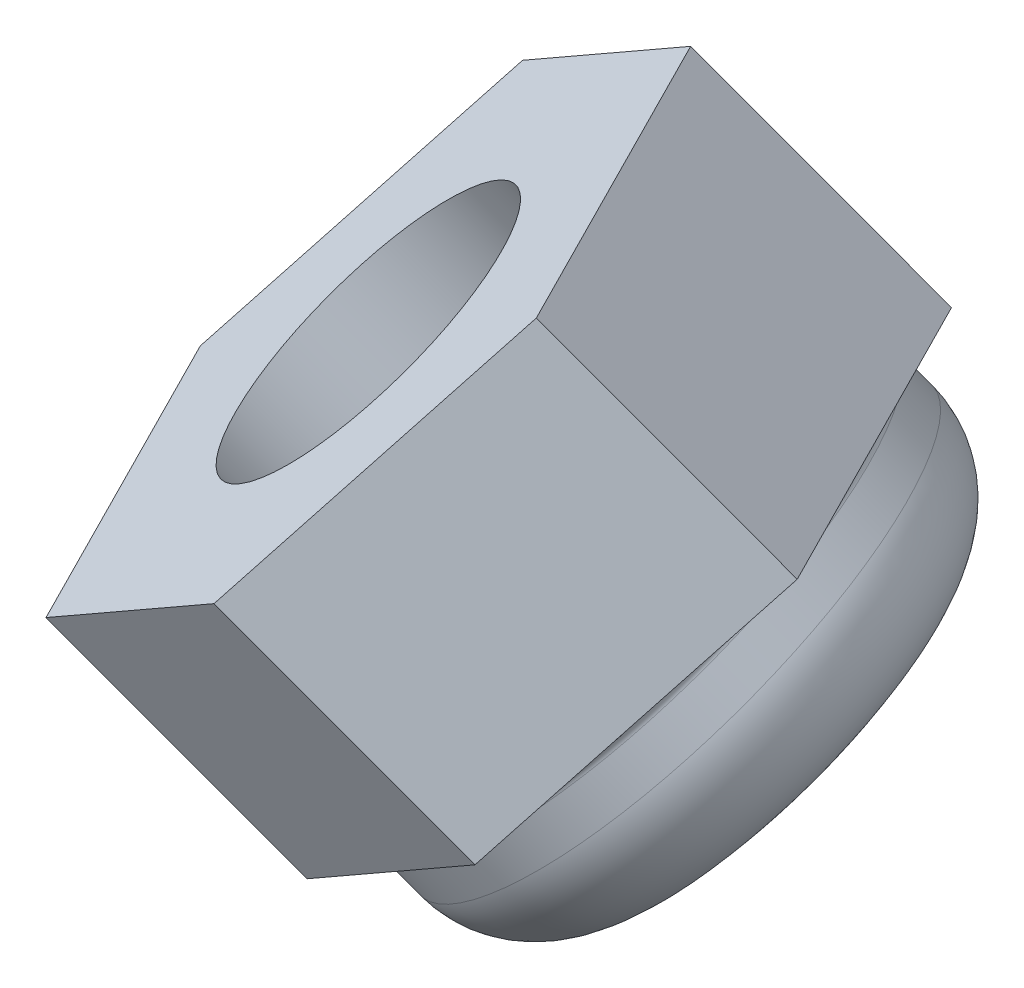
ISO-10303-21;
HEADER;
FILE_DESCRIPTION(('STEP AP214'),'2;1');
FILE_NAME('part.step','',(''),(''),'','','');
FILE_SCHEMA(('AUTOMOTIVE_DESIGN { 1 0 10303 214 1 1 1 1 }'));
ENDSEC;
DATA;
#1=APPLICATION_CONTEXT('core data for automotive mechanical design processes');
#2=APPLICATION_PROTOCOL_DEFINITION('international standard','automotive_design',2000,#1);
#3=PRODUCT_CONTEXT('',#1,'mechanical');
#4=PRODUCT('Part','Part','',(#3));
#5=PRODUCT_RELATED_PRODUCT_CATEGORY('part','',(#4));
#6=PRODUCT_DEFINITION_FORMATION('','',#4);
#7=PRODUCT_DEFINITION_CONTEXT('part definition',#1,'design');
#8=PRODUCT_DEFINITION('design','',#6,#7);
#9=PRODUCT_DEFINITION_SHAPE('','',#8);
#10=(LENGTH_UNIT() NAMED_UNIT(*) SI_UNIT(.MILLI.,.METRE.));
#11=(NAMED_UNIT(*) PLANE_ANGLE_UNIT() SI_UNIT($,.RADIAN.));
#12=(NAMED_UNIT(*) SI_UNIT($,.STERADIAN.) SOLID_ANGLE_UNIT());
#13=UNCERTAINTY_MEASURE_WITH_UNIT(LENGTH_MEASURE(1.E-05),#10,'distance_accuracy_value','');
#14=(GEOMETRIC_REPRESENTATION_CONTEXT(3) GLOBAL_UNCERTAINTY_ASSIGNED_CONTEXT((#13)) GLOBAL_UNIT_ASSIGNED_CONTEXT((#10,
#11,#12)) REPRESENTATION_CONTEXT('',''));
#15=CARTESIAN_POINT('',(0.,0.,0.));
#16=DIRECTION('',(0.,0.,1.));
#17=DIRECTION('',(1.,0.,0.));
#18=AXIS2_PLACEMENT_3D('',#15,#16,#17);
#19=CARTESIAN_POINT('',(-7.81654763488652,-44.7743989689793,-57.2258527698471));
#20=DIRECTION('',(-0.61290058053373,0.707106781184313,0.352637034902145));
#21=DIRECTION('',(-0.755649570705954,-0.654976126505315,0.));
#22=AXIS2_PLACEMENT_3D('',#19,#20,#21);
#23=CYLINDRICAL_SURFACE('',#22,1.49999999999652);
#24=CARTESIAN_POINT('',(-10.4213751021575,-41.7691951489429,-55.7271453715115));
#25=DIRECTION('',(-0.61290058053373,0.707106781184313,0.352637034902145));
#26=DIRECTION('',(-0.755649570705954,-0.654976126505315,0.));
#27=AXIS2_PLACEMENT_3D('',#24,#25,#26);
#28=CIRCLE('',#27,1.49999999999652);
#29=CARTESIAN_POINT('',(-11.5548494582138,-42.7516593386986,-55.7271453715115));
#30=VERTEX_POINT('',#29);
#31=EDGE_CURVE('E105',#30,#30,#28,.T.);
#32=ORIENTED_EDGE('',*,*,#31,.T.);
#33=EDGE_LOOP('',(#32));
#34=FACE_BOUND('',#33,.T.);
#35=CARTESIAN_POINT('',(-7.81654763488652,-44.7743989689793,-57.2258527698471));
#36=DIRECTION('',(-0.61290058053373,0.707106781184313,0.352637034902145));
#37=DIRECTION('',(-0.755649570705954,-0.654976126505315,0.));
#38=AXIS2_PLACEMENT_3D('',#35,#36,#37);
#39=CIRCLE('',#38,1.49999999999652);
#40=CARTESIAN_POINT('',(-8.95002199094282,-45.756863158735,-57.2258527698471));
#41=VERTEX_POINT('',#40);
#42=EDGE_CURVE('E109',#41,#41,#39,.T.);
#43=ORIENTED_EDGE('',*,*,#42,.F.);
#44=EDGE_LOOP('',(#43));
#45=FACE_BOUND('',#44,.T.);
#46=ADVANCED_FACE('F17',(#34,#45),#23,.F.);
#47=CARTESIAN_POINT('',(-6.011456576919,-43.22113606169,-57.20311374404));
#48=DIRECTION('',(0.612900580532539,-0.707106781186679,-0.352637034899471));
#49=DIRECTION('',(-0.378104557586791,-0.654330019279194,0.654896304312512));
#50=AXIS2_PLACEMENT_3D('',#47,#48,#49);
#51=PLANE('',#50);
#52=ORIENTED_EDGE('',*,*,#42,.T.);
#53=EDGE_LOOP('',(#52));
#54=FACE_BOUND('',#53,.T.);
#55=CARTESIAN_POINT('',(-7.81654763488971,-44.7743989689915,-57.2258527698307));
#56=DIRECTION('',(-0.612900580531282,0.70710678118801,0.352637034898986));
#57=DIRECTION('',(0.3781045575874,0.65433001927786,-0.654896304313494));
#58=AXIS2_PLACEMENT_3D('',#55,#56,#57);
#59=CIRCLE('',#58,1.60000000000153);
#60=CARTESIAN_POINT('',(-8.42151492702986,-45.8213269998347,-56.178018682929));
#61=VERTEX_POINT('',#60);
#62=CARTESIAN_POINT('',(-7.21158034275055,-43.7274709381431,-58.2736868567318));
#63=VERTEX_POINT('',#62);
#64=EDGE_CURVE('E112',#61,#63,#59,.F.);
#65=ORIENTED_EDGE('',*,*,#64,.T.);
#66=CARTESIAN_POINT('',(-7.81654763488971,-44.7743989689915,-57.2258527698307));
#67=DIRECTION('',(-0.612900580531282,0.70710678118801,0.352637034898986));
#68=DIRECTION('',(-0.378104557587544,-0.654330019277914,0.654896304313357));
#69=AXIS2_PLACEMENT_3D('',#66,#67,#68);
#70=CIRCLE('',#69,1.60000000000153);
#71=EDGE_CURVE('E108',#63,#61,#70,.F.);
#72=ORIENTED_EDGE('',*,*,#71,.T.);
#73=EDGE_LOOP('',(#65,#72));
#74=FACE_BOUND('',#73,.T.);
#75=ADVANCED_FACE('F189',(#54,#74),#51,.T.);
#76=CARTESIAN_POINT('',(-7.173389440549,-38.81574595516,-56.00423383806));
#77=DIRECTION('',(0.61290058053355,-0.707106781186272,-0.35263703489853));
#78=DIRECTION('',(-0.378104557586111,-0.654330019278962,0.654896304313137));
#79=AXIS2_PLACEMENT_3D('',#76,#77,#78);
#80=PLANE('',#79);
#81=ORIENTED_EDGE('',*,*,#31,.F.);
#82=EDGE_LOOP('',(#81));
#83=FACE_BOUND('',#82,.T.);
#84=DIRECTION('',(0.78992028962174,0.559305418448253,0.251402833990253));
#85=VECTOR('',#84,1.);
#86=CARTESIAN_POINT('',(-10.4748987801751,-40.5794348969403,-58.2058760464043));
#87=LINE('',#86,#85);
#88=CARTESIAN_POINT('',(-11.7290656827647,-41.4674515151694,-58.6050316545677));
#89=VERTEX_POINT('',#88);
#90=CARTESIAN_POINT('',(-9.22073187769769,-39.691418278793,-57.8067204382735));
#91=VERTEX_POINT('',#90);
#92=EDGE_CURVE('E147',#89,#91,#87,.T.);
#93=ORIENTED_EDGE('',*,*,#92,.F.);
#94=DIRECTION('',(0.378104557587663,0.654330019278937,-0.654896304312266));
#95=VECTOR('',#94,1.);
#96=CARTESIAN_POINT('',(-12.3293872950506,-42.5063399502852,-57.5652441212044));
#97=LINE('',#96,#95);
#98=CARTESIAN_POINT('',(-12.9297089073393,-43.5452283854007,-56.5254565878416));
#99=VERTEX_POINT('',#98);
#100=EDGE_CURVE('E151',#99,#89,#97,.T.);
#101=ORIENTED_EDGE('',*,*,#100,.F.);
#102=DIRECTION('',(-0.411815732035274,0.0950246008273509,-0.906299138301397));
#103=VECTOR('',#102,1.);
#104=CARTESIAN_POINT('',(-12.2758636170356,-43.6961002022853,-55.0865134463143));
#105=LINE('',#104,#103);
#106=CARTESIAN_POINT('',(-11.6220183266162,-43.8469720190935,-53.6475703047494));
#107=VERTEX_POINT('',#106);
#108=EDGE_CURVE('E85',#107,#99,#105,.T.);
#109=ORIENTED_EDGE('',*,*,#108,.F.);
#110=DIRECTION('',(-0.789920289620018,-0.55930541845189,-0.251402833987573));
#111=VECTOR('',#110,1.);
#112=CARTESIAN_POINT('',(-10.3678514241397,-42.9589554009452,-53.2484146966194));
#113=LINE('',#112,#111);
#114=CARTESIAN_POINT('',(-9.11368452155204,-42.0709387827129,-52.8492590884546));
#115=VERTEX_POINT('',#114);
#116=EDGE_CURVE('E81',#115,#107,#113,.T.);
#117=ORIENTED_EDGE('',*,*,#116,.F.);
#118=DIRECTION('',(-0.378104557586419,-0.654330019277777,0.654896304314142));
#119=VECTOR('',#118,1.);
#120=CARTESIAN_POINT('',(-8.51336290926467,-41.0320503475954,-53.8890466218194));
#121=LINE('',#120,#119);
#122=CARTESIAN_POINT('',(-7.91304129697766,-39.9931619124808,-54.9288341551821));
#123=VERTEX_POINT('',#122);
#124=EDGE_CURVE('E156',#123,#115,#121,.T.);
#125=ORIENTED_EDGE('',*,*,#124,.F.);
#126=DIRECTION('',(0.411815732033934,-0.0950246008270996,0.906299138302032));
#127=VECTOR('',#126,1.);
#128=CARTESIAN_POINT('',(-8.56688658728017,-39.8422900955953,-56.3677772967094));
#129=LINE('',#128,#127);
#130=EDGE_CURVE('E137',#91,#123,#129,.T.);
#131=ORIENTED_EDGE('',*,*,#130,.F.);
#132=EDGE_LOOP('',(#93,#101,#109,#117,#125,#131));
#133=FACE_BOUND('',#132,.T.);
#134=ADVANCED_FACE('F166',(#83,#133),#80,.F.);
#135=CARTESIAN_POINT('',(-8.42944821542099,-44.0672921878035,-56.8732157349317));
#136=DIRECTION('',(0.612900580531282,-0.70710678118801,-0.352637034898986));
#137=DIRECTION('',(-0.378104557588239,-0.654330019278183,0.654896304312686));
#138=AXIS2_PLACEMENT_3D('',#135,#136,#137);
#139=TOROIDAL_SURFACE('',#138,1.60000000000219,1.);
#140=ORIENTED_EDGE('',*,*,#64,.F.);
#141=ORIENTED_EDGE('',*,*,#71,.F.);
#142=EDGE_LOOP('',(#140,#141));
#143=FACE_BOUND('',#142,.T.);
#144=CARTESIAN_POINT('',(-8.42944821543103,-44.0672921877919,-56.873215734926));
#145=DIRECTION('',(0.612900580536237,-0.70710678118257,-0.352637034901283));
#146=DIRECTION('',(-0.378104557584169,-0.654330019283159,0.654896304310064));
#147=AXIS2_PLACEMENT_3D('',#144,#145,#146);
#148=CIRCLE('',#147,2.59999999999843);
#149=CARTESIAN_POINT('',(-9.41252006514927,-45.7685502379271,-55.1704853437208));
#150=VERTEX_POINT('',#149);
#151=EDGE_CURVE('E101',#150,#150,#148,.T.);
#152=ORIENTED_EDGE('',*,*,#151,.T.);
#153=EDGE_LOOP('',(#152));
#154=FACE_BOUND('',#153,.T.);
#155=ADVANCED_FACE('F161',(#143,#154),#139,.T.);
#156=CARTESIAN_POINT('',(-7.922737964415,-39.91271550211,-54.9510306196));
#157=DIRECTION('',(0.693822615598157,0.268052655033845,0.668399545342334));
#158=DIRECTION('',(-0.378104557586418,-0.654330019277778,0.654896304314143));
#159=AXIS2_PLACEMENT_3D('',#156,#157,#158);
#160=PLANE('',#159);
#161=ORIENTED_EDGE('',*,*,#124,.T.);
#162=DIRECTION('',(-0.612900580533941,0.707106781185783,0.352637034898832));
#163=VECTOR('',#162,1.);
#164=CARTESIAN_POINT('',(-8.27094622331854,-43.0432106068442,-53.3341350114415));
#165=LINE('',#164,#163);
#166=CARTESIAN_POINT('',(-7.42820792508417,-44.0154824309769,-53.8190109344259));
#167=VERTEX_POINT('',#166);
#168=EDGE_CURVE('E67',#167,#115,#165,.T.);
#169=ORIENTED_EDGE('',*,*,#168,.F.);
#170=DIRECTION('',(-0.378104557586366,-0.654330019278157,0.654896304313794));
#171=VECTOR('',#170,1.);
#172=CARTESIAN_POINT('',(-6.82788631279821,-42.9765939958637,-54.8587984677878));
#173=LINE('',#172,#171);
#174=CARTESIAN_POINT('',(-6.22756470051156,-41.9377055607489,-55.8985860011516));
#175=VERTEX_POINT('',#174);
#176=EDGE_CURVE('E99',#175,#167,#173,.T.);
#177=ORIENTED_EDGE('',*,*,#176,.F.);
#178=DIRECTION('',(0.612900580532254,-0.707106781187635,-0.35263703489805));
#179=VECTOR('',#178,1.);
#180=CARTESIAN_POINT('',(-7.07030299874465,-40.9654337366145,-55.4137100781663));
#181=LINE('',#180,#179);
#182=EDGE_CURVE('E145',#123,#175,#181,.T.);
#183=ORIENTED_EDGE('',*,*,#182,.F.);
#184=EDGE_LOOP('',(#161,#169,#177,#183));
#185=FACE_BOUND('',#184,.T.);
#186=ADVANCED_FACE('F165',(#185),#160,.T.);
#187=CARTESIAN_POINT('',(-9.097227377378,-41.99652724502,-52.81389782721));
#188=DIRECTION('',(0.0194631556437923,-0.432640091636891,0.901356609051494));
#189=DIRECTION('',(-0.789920289620006,-0.559305418451905,-0.251402833987577));
#190=AXIS2_PLACEMENT_3D('',#187,#188,#189);
#191=PLANE('',#190);
#192=ORIENTED_EDGE('',*,*,#116,.T.);
#193=DIRECTION('',(-0.612900580533232,0.707106781188328,0.35263703489496));
#194=VECTOR('',#193,1.);
#195=CARTESIAN_POINT('',(-10.7792800284991,-44.8192438433045,-54.132446227771));
#196=LINE('',#195,#194);
#197=CARTESIAN_POINT('',(-9.93654173026565,-45.7915156674354,-54.617322150754));
#198=VERTEX_POINT('',#197);
#199=EDGE_CURVE('E73',#198,#107,#196,.T.);
#200=ORIENTED_EDGE('',*,*,#199,.F.);
#201=DIRECTION('',(-0.789920289621149,-0.559305418449632,-0.251402833989043));
#202=VECTOR('',#201,1.);
#203=CARTESIAN_POINT('',(-7.42820792508497,-44.0154824309784,-53.8190109344241));
#204=LINE('',#203,#202);
#205=EDGE_CURVE('E77',#167,#198,#204,.T.);
#206=ORIENTED_EDGE('',*,*,#205,.F.);
#207=ORIENTED_EDGE('',*,*,#168,.T.);
#208=EDGE_LOOP('',(#192,#200,#206,#207));
#209=FACE_BOUND('',#208,.T.);
#210=ADVANCED_FACE('F75',(#209),#191,.T.);
#211=CARTESIAN_POINT('',(-11.62957404705,-43.81411601888,-53.57061754221));
#212=DIRECTION('',(-0.674359459955911,-0.70069274666966,0.232957063710248));
#213=DIRECTION('',(-0.411815732035317,0.0950246008272967,-0.906299138301383));
#214=AXIS2_PLACEMENT_3D('',#211,#212,#213);
#215=PLANE('',#214);
#216=ORIENTED_EDGE('',*,*,#108,.T.);
#217=DIRECTION('',(-0.612900580534812,0.707106781185176,0.352637034898533));
#218=VECTOR('',#217,1.);
#219=CARTESIAN_POINT('',(-12.0869706091035,-44.5175002095304,-57.0103325108294));
#220=LINE('',#219,#218);
#221=CARTESIAN_POINT('',(-11.2442323108709,-45.4897720336599,-57.4952084338147));
#222=VERTEX_POINT('',#221);
#223=EDGE_CURVE('E91',#222,#99,#220,.T.);
#224=ORIENTED_EDGE('',*,*,#223,.F.);
#225=DIRECTION('',(-0.411815732034053,0.0950246008286369,-0.906299138301817));
#226=VECTOR('',#225,1.);
#227=CARTESIAN_POINT('',(-9.93654173026599,-45.7915156674345,-54.6173221507564));
#228=LINE('',#227,#226);
#229=EDGE_CURVE('E88',#198,#222,#228,.T.);
#230=ORIENTED_EDGE('',*,*,#229,.F.);
#231=ORIENTED_EDGE('',*,*,#199,.T.);
#232=EDGE_LOOP('',(#216,#224,#230,#231));
#233=FACE_BOUND('',#232,.T.);
#234=ADVANCED_FACE('F89',(#233),#215,.T.);
#235=CARTESIAN_POINT('',(-12.98743130376,-43.54789304984,-56.46447004959));
#236=DIRECTION('',(-0.693822615595917,-0.268052655033759,-0.668399545344693));
#237=DIRECTION('',(0.378104557587688,0.654330019278928,-0.65489630431226));
#238=AXIS2_PLACEMENT_3D('',#235,#236,#237);
#239=PLANE('',#238);
#240=ORIENTED_EDGE('',*,*,#100,.T.);
#241=DIRECTION('',(-0.612900580534068,0.707106781187747,0.352637034894672));
#242=VECTOR('',#241,1.);
#243=CARTESIAN_POINT('',(-10.8863273845314,-42.4397233393009,-59.0899075775534));
#244=LINE('',#243,#242);
#245=CARTESIAN_POINT('',(-10.0435890862972,-43.4119951634329,-59.5747835005365));
#246=VERTEX_POINT('',#245);
#247=EDGE_CURVE('E150',#246,#89,#244,.T.);
#248=ORIENTED_EDGE('',*,*,#247,.F.);
#249=DIRECTION('',(0.378104557586967,0.654330019278699,-0.654896304312905));
#250=VECTOR('',#249,1.);
#251=CARTESIAN_POINT('',(-10.6439106985838,-44.4508835985463,-58.5349959671772));
#252=LINE('',#251,#250);
#253=EDGE_CURVE('E95',#222,#246,#252,.T.);
#254=ORIENTED_EDGE('',*,*,#253,.F.);
#255=ORIENTED_EDGE('',*,*,#223,.T.);
#256=EDGE_LOOP('',(#240,#248,#254,#255));
#257=FACE_BOUND('',#256,.T.);
#258=ADVANCED_FACE('F257',(#257),#239,.T.);
#259=CARTESIAN_POINT('',(-11.8129418908,-41.46408130693,-58.60160284198));
#260=DIRECTION('',(-0.0194631556376765,0.432640091635867,-0.901356609052117));
#261=DIRECTION('',(0.789920289621765,0.559305418448193,0.251402833990308));
#262=AXIS2_PLACEMENT_3D('',#259,#260,#261);
#263=PLANE('',#262);
#264=ORIENTED_EDGE('',*,*,#92,.T.);
#265=DIRECTION('',(-0.612900580533712,0.707106781185951,0.352637034898891));
#266=VECTOR('',#265,1.);
#267=CARTESIAN_POINT('',(-8.3779935793494,-40.6636901028405,-58.2915963612239));
#268=LINE('',#267,#266);
#269=CARTESIAN_POINT('',(-7.53525528111574,-41.6359619269737,-58.7764722842085));
#270=VERTEX_POINT('',#269);
#271=EDGE_CURVE('E146',#270,#91,#268,.T.);
#272=ORIENTED_EDGE('',*,*,#271,.F.);
#273=DIRECTION('',(0.789920289621136,0.559305418449912,0.251402833988461));
#274=VECTOR('',#273,1.);
#275=CARTESIAN_POINT('',(-10.043589086297,-43.4119951634311,-59.5747835005384));
#276=LINE('',#275,#274);
#277=EDGE_CURVE('E229',#246,#270,#276,.T.);
#278=ORIENTED_EDGE('',*,*,#277,.F.);
#279=ORIENTED_EDGE('',*,*,#247,.T.);
#280=EDGE_LOOP('',(#264,#272,#278,#279));
#281=FACE_BOUND('',#280,.T.);
#282=ADVANCED_FACE('F240',(#281),#263,.T.);
#283=CARTESIAN_POINT('',(-9.280595221124,-39.64649253307,-57.84488312698));
#284=DIRECTION('',(0.674359459954424,0.700692746671719,-0.232957063708359));
#285=DIRECTION('',(0.411815732033937,-0.0950246008270415,0.906299138302036));
#286=AXIS2_PLACEMENT_3D('',#283,#284,#285);
#287=PLANE('',#286);
#288=ORIENTED_EDGE('',*,*,#130,.T.);
#289=ORIENTED_EDGE('',*,*,#182,.T.);
#290=DIRECTION('',(0.4118157320341,-0.0950246008285908,0.9062991383018));
#291=VECTOR('',#290,1.);
#292=CARTESIAN_POINT('',(-7.53525528111672,-41.6359619269747,-58.7764722842082));
#293=LINE('',#292,#291);
#294=EDGE_CURVE('E236',#270,#175,#293,.T.);
#295=ORIENTED_EDGE('',*,*,#294,.F.);
#296=ORIENTED_EDGE('',*,*,#271,.T.);
#297=EDGE_LOOP('',(#288,#289,#295,#296));
#298=FACE_BOUND('',#297,.T.);
#299=ADVANCED_FACE('F246',(#298),#287,.T.);
#300=CARTESIAN_POINT('',(-8.67460844764586,-43.7844494753185,-56.7321609209652));
#301=DIRECTION('',(0.612900580536237,-0.707106781182569,-0.352637034901285));
#302=DIRECTION('',(0.755649570703828,0.654976126507768,0.));
#303=AXIS2_PLACEMENT_3D('',#300,#301,#302);
#304=CYLINDRICAL_SURFACE('',#303,2.59999999999824);
#305=ORIENTED_EDGE('',*,*,#151,.F.);
#306=EDGE_LOOP('',(#305));
#307=FACE_BOUND('',#306,.T.);
#308=CARTESIAN_POINT('',(-8.67460844763071,-43.7844494753272,-56.7321609209736));
#309=DIRECTION('',(0.612900580531264,-0.707106781188014,-0.352637034899012));
#310=DIRECTION('',(-0.378104557588883,-0.654330019278439,0.654896304312058));
#311=AXIS2_PLACEMENT_3D('',#308,#309,#310);
#312=CIRCLE('',#311,2.60000000000142);
#313=CARTESIAN_POINT('',(-9.65768029736234,-45.4857075254521,-55.0294305297613));
#314=VERTEX_POINT('',#313);
#315=EDGE_CURVE('E30',#314,#314,#312,.F.);
#316=ORIENTED_EDGE('',*,*,#315,.F.);
#317=EDGE_LOOP('',(#316));
#318=FACE_BOUND('',#317,.T.);
#319=ADVANCED_FACE('F129',(#307,#318),#304,.T.);
#320=CARTESIAN_POINT('',(-5.487912844083,-40.76028960343,-56.97398568403));
#321=DIRECTION('',(0.6129005805327,-0.70710678118709,-0.352637034898366));
#322=DIRECTION('',(-0.378104557586354,-0.654330019278146,0.654896304313812));
#323=AXIS2_PLACEMENT_3D('',#320,#321,#322);
#324=PLANE('',#323);
#325=CARTESIAN_POINT('',(-8.73589850568376,-43.7137387972085,-56.6968972174838));
#326=DIRECTION('',(0.612900580531264,-0.707106781188014,-0.352637034899012));
#327=DIRECTION('',(0.378104557589027,0.654330019278495,-0.65489630431192));
#328=AXIS2_PLACEMENT_3D('',#325,#326,#327);
#329=CIRCLE('',#328,2.7000000000015);
#330=CARTESIAN_POINT('',(-7.71501620019863,-41.9470477451549,-58.4651172391273));
#331=VERTEX_POINT('',#330);
#332=CARTESIAN_POINT('',(-9.75678081117461,-45.4804298492593,-54.9286771958391));
#333=VERTEX_POINT('',#332);
#334=EDGE_CURVE('E11',#331,#333,#329,.T.);
#335=ORIENTED_EDGE('',*,*,#334,.F.);
#336=CARTESIAN_POINT('',(-8.73589850568377,-43.7137387972085,-56.6968972174838));
#337=DIRECTION('',(0.612900580531264,-0.707106781188014,-0.352637034899012));
#338=DIRECTION('',(-0.378104557588882,-0.654330019278439,0.654896304312059));
#339=AXIS2_PLACEMENT_3D('',#336,#337,#338);
#340=CIRCLE('',#339,2.7000000000015);
#341=EDGE_CURVE('E37',#331,#333,#340,.F.);
#342=ORIENTED_EDGE('',*,*,#341,.T.);
#343=EDGE_LOOP('',(#335,#342));
#344=FACE_BOUND('',#343,.T.);
#345=ORIENTED_EDGE('',*,*,#277,.T.);
#346=ORIENTED_EDGE('',*,*,#294,.T.);
#347=ORIENTED_EDGE('',*,*,#176,.T.);
#348=ORIENTED_EDGE('',*,*,#205,.T.);
#349=ORIENTED_EDGE('',*,*,#229,.T.);
#350=ORIENTED_EDGE('',*,*,#253,.T.);
#351=EDGE_LOOP('',(#345,#346,#347,#348,#349,#350));
#352=FACE_BOUND('',#351,.T.);
#353=ADVANCED_FACE('F19',(#344,#352),#324,.T.);
#354=CARTESIAN_POINT('',(-8.67460844763064,-43.7844494753273,-56.7321609209737));
#355=DIRECTION('',(0.612900580531264,-0.707106781188014,-0.352637034899012));
#356=DIRECTION('',(-0.378104557588823,-0.654330019278416,0.654896304312116));
#357=AXIS2_PLACEMENT_3D('',#354,#355,#356);
#358=TOROIDAL_SURFACE('',#357,2.70000000000142,0.1);
#359=ORIENTED_EDGE('',*,*,#315,.T.);
#360=EDGE_LOOP('',(#359));
#361=FACE_BOUND('',#360,.T.);
#362=ORIENTED_EDGE('',*,*,#334,.T.);
#363=ORIENTED_EDGE('',*,*,#341,.F.);
#364=EDGE_LOOP('',(#362,#363));
#365=FACE_BOUND('',#364,.T.);
#366=ADVANCED_FACE('F118',(#361,#365),#358,.F.);
#367=CLOSED_SHELL('',(#46,#75,#134,#155,#186,#210,#234,#258,#282,#299,#319,#353,#366));
#368=MANIFOLD_SOLID_BREP('B1',#367);
#369=ADVANCED_BREP_SHAPE_REPRESENTATION('',(#18,#368),#14);
#370=SHAPE_DEFINITION_REPRESENTATION(#9,#369);
ENDSEC;
END-ISO-10303-21;
